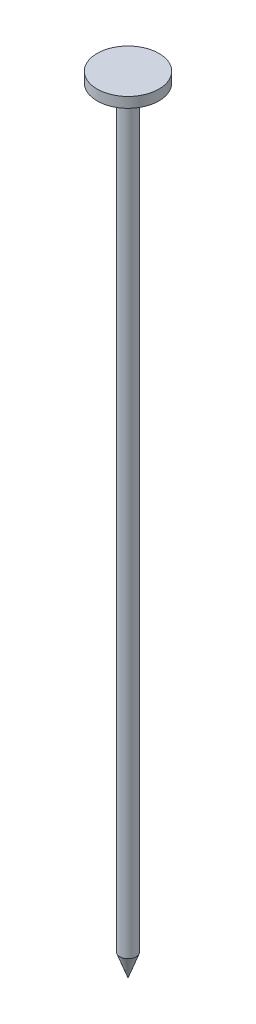
ISO-10303-21;
HEADER;
FILE_DESCRIPTION(('STEP AP214'),'2;1');
FILE_NAME('part.step','',(''),(''),'','','');
FILE_SCHEMA(('AUTOMOTIVE_DESIGN { 1 0 10303 214 1 1 1 1 }'));
ENDSEC;
DATA;
#1=APPLICATION_CONTEXT('core data for automotive mechanical design processes');
#2=APPLICATION_PROTOCOL_DEFINITION('international standard','automotive_design',2000,#1);
#3=PRODUCT_CONTEXT('',#1,'mechanical');
#4=PRODUCT('Part','Part','',(#3));
#5=PRODUCT_RELATED_PRODUCT_CATEGORY('part','',(#4));
#6=PRODUCT_DEFINITION_FORMATION('','',#4);
#7=PRODUCT_DEFINITION_CONTEXT('part definition',#1,'design');
#8=PRODUCT_DEFINITION('design','',#6,#7);
#9=PRODUCT_DEFINITION_SHAPE('','',#8);
#10=(LENGTH_UNIT() NAMED_UNIT(*) SI_UNIT(.MILLI.,.METRE.));
#11=(NAMED_UNIT(*) PLANE_ANGLE_UNIT() SI_UNIT($,.RADIAN.));
#12=(NAMED_UNIT(*) SI_UNIT($,.STERADIAN.) SOLID_ANGLE_UNIT());
#13=UNCERTAINTY_MEASURE_WITH_UNIT(LENGTH_MEASURE(1.E-05),#10,'distance_accuracy_value','');
#14=(GEOMETRIC_REPRESENTATION_CONTEXT(3) GLOBAL_UNCERTAINTY_ASSIGNED_CONTEXT((#13)) GLOBAL_UNIT_ASSIGNED_CONTEXT((#10,
#11,#12)) REPRESENTATION_CONTEXT('',''));
#15=CARTESIAN_POINT('',(0.,0.,0.));
#16=DIRECTION('',(0.,0.,1.));
#17=DIRECTION('',(1.,0.,0.));
#18=AXIS2_PLACEMENT_3D('',#15,#16,#17);
#19=CARTESIAN_POINT('',(0.,0.999999999999999,0.));
#20=DIRECTION('',(0.,1.,0.));
#21=DIRECTION('',(0.,0.,1.));
#22=AXIS2_PLACEMENT_3D('',#19,#20,#21);
#23=PLANE('',#22);
#24=CARTESIAN_POINT('',(0.,1.,0.));
#25=DIRECTION('',(0.,-1.,0.));
#26=DIRECTION('',(0.,0.,-1.));
#27=AXIS2_PLACEMENT_3D('',#24,#25,#26);
#28=CIRCLE('',#27,3.);
#29=CARTESIAN_POINT('',(0.,1.,-3.));
#30=VERTEX_POINT('',#29);
#31=EDGE_CURVE('E11',#30,#30,#28,.T.);
#32=ORIENTED_EDGE('',*,*,#31,.F.);
#33=EDGE_LOOP('',(#32));
#34=FACE_BOUND('',#33,.T.);
#35=ADVANCED_FACE('F33',(#34),#23,.T.);
#36=CARTESIAN_POINT('',(0.,-75.2,0.));
#37=DIRECTION('',(0.,-1.,0.));
#38=DIRECTION('',(0.,0.,-1.));
#39=AXIS2_PLACEMENT_3D('',#36,#37,#38);
#40=CYLINDRICAL_SURFACE('',#39,3.);
#41=ORIENTED_EDGE('',*,*,#31,.T.);
#42=EDGE_LOOP('',(#41));
#43=FACE_BOUND('',#42,.T.);
#44=CARTESIAN_POINT('',(0.,0.,0.));
#45=DIRECTION('',(0.,-1.,0.));
#46=DIRECTION('',(0.,0.,-1.));
#47=AXIS2_PLACEMENT_3D('',#44,#45,#46);
#48=CIRCLE('',#47,3.);
#49=CARTESIAN_POINT('',(0.,0.,-3.));
#50=VERTEX_POINT('',#49);
#51=EDGE_CURVE('E39',#50,#50,#48,.T.);
#52=ORIENTED_EDGE('',*,*,#51,.F.);
#53=EDGE_LOOP('',(#52));
#54=FACE_BOUND('',#53,.T.);
#55=ADVANCED_FACE('F55',(#43,#54),#40,.T.);
#56=CARTESIAN_POINT('',(3.,0.,0.));
#57=DIRECTION('',(0.,-1.,0.));
#58=DIRECTION('',(0.,0.,-1.));
#59=AXIS2_PLACEMENT_3D('',#56,#57,#58);
#60=PLANE('',#59);
#61=ORIENTED_EDGE('',*,*,#51,.T.);
#62=EDGE_LOOP('',(#61));
#63=FACE_BOUND('',#62,.T.);
#64=CARTESIAN_POINT('',(0.,0.,0.));
#65=DIRECTION('',(0.,-1.,0.));
#66=DIRECTION('',(0.,0.,-1.));
#67=AXIS2_PLACEMENT_3D('',#64,#65,#66);
#68=CIRCLE('',#67,0.79375);
#69=CARTESIAN_POINT('',(0.,0.,-0.79375));
#70=VERTEX_POINT('',#69);
#71=EDGE_CURVE('E66',#70,#70,#68,.T.);
#72=ORIENTED_EDGE('',*,*,#71,.F.);
#73=EDGE_LOOP('',(#72));
#74=FACE_BOUND('',#73,.T.);
#75=ADVANCED_FACE('F50',(#63,#74),#60,.T.);
#76=CARTESIAN_POINT('',(0.,-75.2,0.));
#77=DIRECTION('',(0.,-1.,0.));
#78=DIRECTION('',(0.,0.,-1.));
#79=AXIS2_PLACEMENT_3D('',#76,#77,#78);
#80=CYLINDRICAL_SURFACE('',#79,0.793750000000005);
#81=ORIENTED_EDGE('',*,*,#71,.T.);
#82=EDGE_LOOP('',(#81));
#83=FACE_BOUND('',#82,.T.);
#84=CARTESIAN_POINT('',(0.,-73.0191897983078,0.));
#85=DIRECTION('',(0.,-1.,0.));
#86=DIRECTION('',(0.,0.,-1.));
#87=AXIS2_PLACEMENT_3D('',#84,#85,#86);
#88=CIRCLE('',#87,0.793750000000009);
#89=CARTESIAN_POINT('',(0.,-73.0191897983078,-0.793750000000009));
#90=VERTEX_POINT('',#89);
#91=EDGE_CURVE('E68',#90,#90,#88,.T.);
#92=ORIENTED_EDGE('',*,*,#91,.F.);
#93=EDGE_LOOP('',(#92));
#94=FACE_BOUND('',#93,.T.);
#95=ADVANCED_FACE('F44',(#83,#94),#80,.T.);
#96=CARTESIAN_POINT('',(0.,-75.2,0.));
#97=DIRECTION('',(0.,1.,0.));
#98=DIRECTION('',(0.,0.,1.));
#99=AXIS2_PLACEMENT_3D('',#96,#97,#98);
#100=CONICAL_SURFACE('',#99,0.,0.349065850398858);
#101=ORIENTED_EDGE('',*,*,#91,.T.);
#102=EDGE_LOOP('',(#101));
#103=FACE_BOUND('',#102,.T.);
#104=CARTESIAN_POINT('',(0.,-75.2,0.));
#105=VERTEX_POINT('',#104);
#106=VERTEX_LOOP('',#105);
#107=FACE_BOUND('',#106,.T.);
#108=ADVANCED_FACE('F42',(#103,#107),#100,.T.);
#109=CLOSED_SHELL('',(#35,#55,#75,#95,#108));
#110=MANIFOLD_SOLID_BREP('B2',#109);
#111=ADVANCED_BREP_SHAPE_REPRESENTATION('',(#18,#110),#14);
#112=SHAPE_DEFINITION_REPRESENTATION(#9,#111);
ENDSEC;
END-ISO-10303-21;
